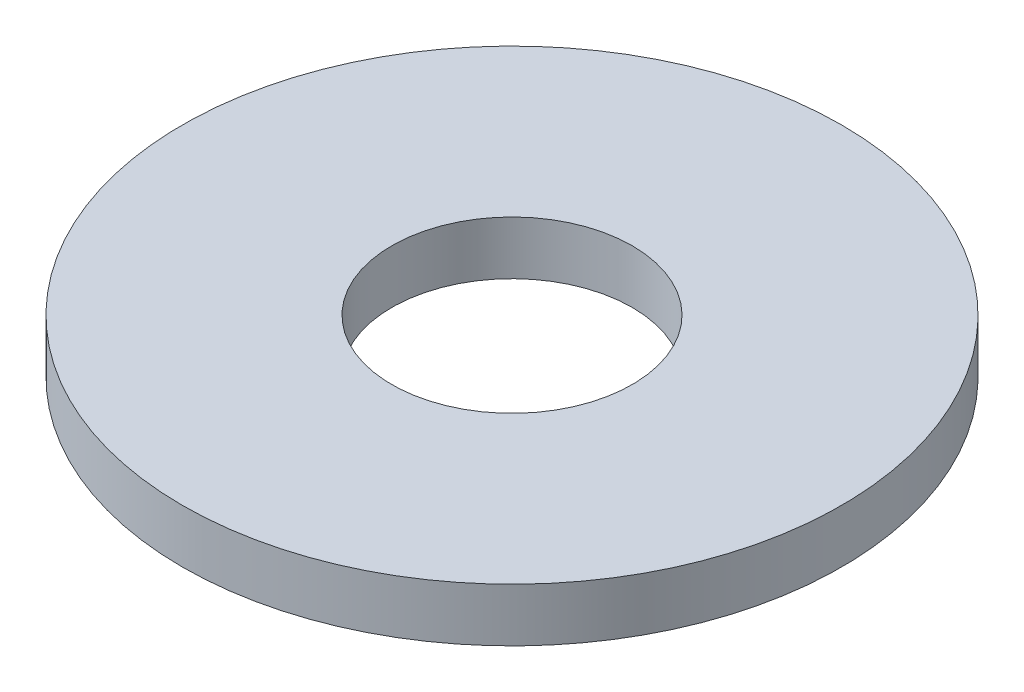
ISO-10303-21;
HEADER;
FILE_DESCRIPTION(('STEP AP214'),'2;1');
FILE_NAME('part.step','',(''),(''),'','','');
FILE_SCHEMA(('AUTOMOTIVE_DESIGN { 1 0 10303 214 1 1 1 1 }'));
ENDSEC;
DATA;
#1=APPLICATION_CONTEXT('core data for automotive mechanical design processes');
#2=APPLICATION_PROTOCOL_DEFINITION('international standard','automotive_design',2000,#1);
#3=PRODUCT_CONTEXT('',#1,'mechanical');
#4=PRODUCT('Part','Part','',(#3));
#5=PRODUCT_RELATED_PRODUCT_CATEGORY('part','',(#4));
#6=PRODUCT_DEFINITION_FORMATION('','',#4);
#7=PRODUCT_DEFINITION_CONTEXT('part definition',#1,'design');
#8=PRODUCT_DEFINITION('design','',#6,#7);
#9=PRODUCT_DEFINITION_SHAPE('','',#8);
#10=(LENGTH_UNIT() NAMED_UNIT(*) SI_UNIT(.MILLI.,.METRE.));
#11=(NAMED_UNIT(*) PLANE_ANGLE_UNIT() SI_UNIT($,.RADIAN.));
#12=(NAMED_UNIT(*) SI_UNIT($,.STERADIAN.) SOLID_ANGLE_UNIT());
#13=UNCERTAINTY_MEASURE_WITH_UNIT(LENGTH_MEASURE(1.E-05),#10,'distance_accuracy_value','');
#14=(GEOMETRIC_REPRESENTATION_CONTEXT(3) GLOBAL_UNCERTAINTY_ASSIGNED_CONTEXT((#13)) GLOBAL_UNIT_ASSIGNED_CONTEXT((#10,
#11,#12)) REPRESENTATION_CONTEXT('',''));
#15=CARTESIAN_POINT('',(0.,0.,0.));
#16=DIRECTION('',(0.,0.,1.));
#17=DIRECTION('',(1.,0.,0.));
#18=AXIS2_PLACEMENT_3D('',#15,#16,#17);
#19=CARTESIAN_POINT('',(0.,0.,0.));
#20=DIRECTION('',(0.,-1.,0.));
#21=DIRECTION('',(0.,0.,-1.));
#22=AXIS2_PLACEMENT_3D('',#19,#20,#21);
#23=CYLINDRICAL_SURFACE('',#22,6.75);
#24=CARTESIAN_POINT('',(0.,11.6445070422535,0.));
#25=DIRECTION('',(0.,-1.,0.));
#26=DIRECTION('',(0.,0.,-1.));
#27=AXIS2_PLACEMENT_3D('',#24,#25,#26);
#28=CIRCLE('',#27,6.75);
#29=CARTESIAN_POINT('',(0.,11.6445070422535,-6.75));
#30=VERTEX_POINT('',#29);
#31=EDGE_CURVE('E10',#30,#30,#28,.T.);
#32=ORIENTED_EDGE('',*,*,#31,.F.);
#33=EDGE_LOOP('',(#32));
#34=FACE_BOUND('',#33,.T.);
#35=CARTESIAN_POINT('',(0.,8.64450704225353,0.));
#36=DIRECTION('',(0.,-1.,0.));
#37=DIRECTION('',(0.,0.,-1.));
#38=AXIS2_PLACEMENT_3D('',#35,#36,#37);
#39=CIRCLE('',#38,6.75);
#40=CARTESIAN_POINT('',(0.,8.64450704225353,-6.75));
#41=VERTEX_POINT('',#40);
#42=EDGE_CURVE('E52',#41,#41,#39,.T.);
#43=ORIENTED_EDGE('',*,*,#42,.T.);
#44=EDGE_LOOP('',(#43));
#45=FACE_BOUND('',#44,.T.);
#46=ADVANCED_FACE('F34',(#34,#45),#23,.F.);
#47=CARTESIAN_POINT('',(-6.75,11.6445070422535,0.));
#48=DIRECTION('',(0.,-1.,0.));
#49=DIRECTION('',(0.,0.,-1.));
#50=AXIS2_PLACEMENT_3D('',#47,#48,#49);
#51=PLANE('',#50);
#52=CARTESIAN_POINT('',(0.,11.6445070422535,0.));
#53=DIRECTION('',(0.,-1.,0.));
#54=DIRECTION('',(0.,0.,-1.));
#55=AXIS2_PLACEMENT_3D('',#52,#53,#54);
#56=CIRCLE('',#55,18.5);
#57=CARTESIAN_POINT('',(0.,11.6445070422535,-18.5));
#58=VERTEX_POINT('',#57);
#59=EDGE_CURVE('E40',#58,#58,#56,.T.);
#60=ORIENTED_EDGE('',*,*,#59,.F.);
#61=EDGE_LOOP('',(#60));
#62=FACE_BOUND('',#61,.T.);
#63=ORIENTED_EDGE('',*,*,#31,.T.);
#64=EDGE_LOOP('',(#63));
#65=FACE_BOUND('',#64,.T.);
#66=ADVANCED_FACE('F69',(#62,#65),#51,.F.);
#67=CARTESIAN_POINT('',(0.,0.,0.));
#68=DIRECTION('',(0.,-1.,0.));
#69=DIRECTION('',(0.,0.,-1.));
#70=AXIS2_PLACEMENT_3D('',#67,#68,#69);
#71=CYLINDRICAL_SURFACE('',#70,18.5);
#72=CARTESIAN_POINT('',(0.,8.64450704225353,0.));
#73=DIRECTION('',(0.,-1.,0.));
#74=DIRECTION('',(0.,0.,-1.));
#75=AXIS2_PLACEMENT_3D('',#72,#73,#74);
#76=CIRCLE('',#75,18.5);
#77=CARTESIAN_POINT('',(0.,8.64450704225353,-18.5));
#78=VERTEX_POINT('',#77);
#79=EDGE_CURVE('E45',#78,#78,#76,.T.);
#80=ORIENTED_EDGE('',*,*,#79,.F.);
#81=EDGE_LOOP('',(#80));
#82=FACE_BOUND('',#81,.T.);
#83=ORIENTED_EDGE('',*,*,#59,.T.);
#84=EDGE_LOOP('',(#83));
#85=FACE_BOUND('',#84,.T.);
#86=ADVANCED_FACE('F64',(#82,#85),#71,.T.);
#87=CARTESIAN_POINT('',(-6.75,8.64450704225353,0.));
#88=DIRECTION('',(0.,1.,0.));
#89=DIRECTION('',(0.,0.,1.));
#90=AXIS2_PLACEMENT_3D('',#87,#88,#89);
#91=PLANE('',#90);
#92=ORIENTED_EDGE('',*,*,#42,.F.);
#93=EDGE_LOOP('',(#92));
#94=FACE_BOUND('',#93,.T.);
#95=ORIENTED_EDGE('',*,*,#79,.T.);
#96=EDGE_LOOP('',(#95));
#97=FACE_BOUND('',#96,.T.);
#98=ADVANCED_FACE('F61',(#94,#97),#91,.F.);
#99=CLOSED_SHELL('',(#46,#66,#86,#98));
#100=MANIFOLD_SOLID_BREP('B2',#99);
#101=ADVANCED_BREP_SHAPE_REPRESENTATION('',(#18,#100),#14);
#102=SHAPE_DEFINITION_REPRESENTATION(#9,#101);
ENDSEC;
END-ISO-10303-21;
